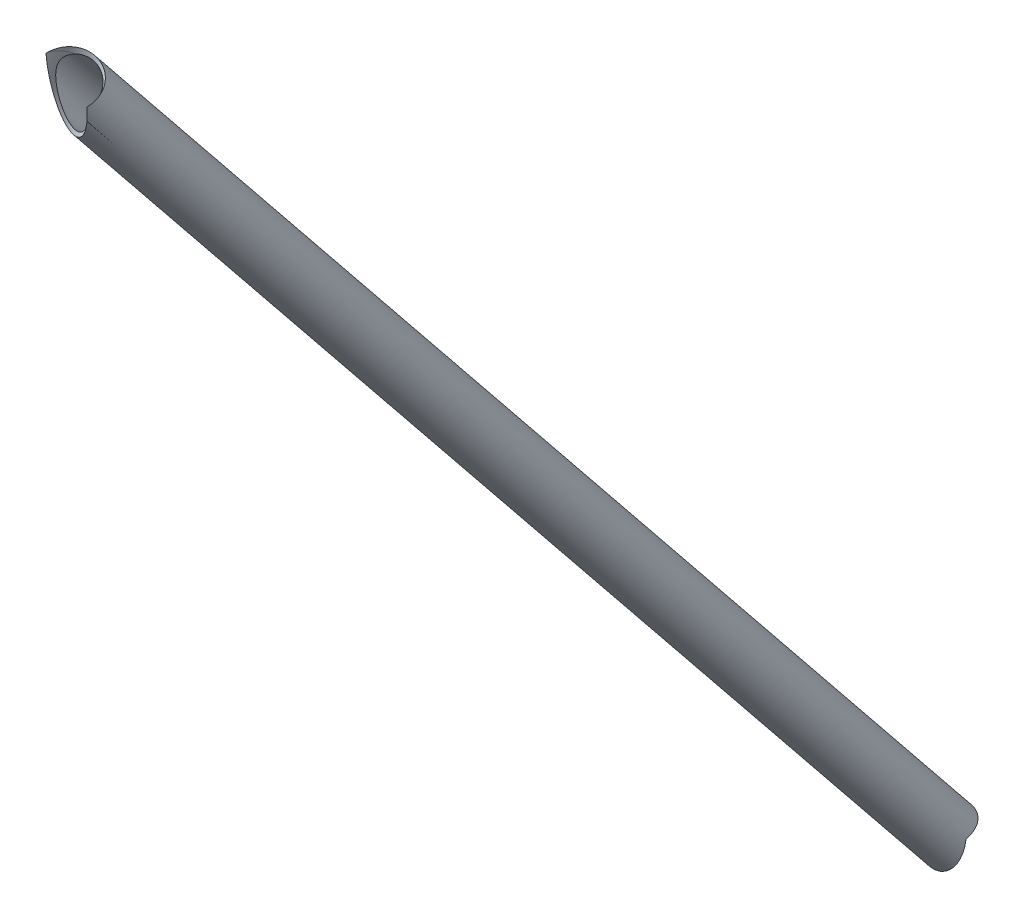
ISO-10303-21;
HEADER;
FILE_DESCRIPTION(('STEP AP214'),'2;1');
FILE_NAME('part.step','',(''),(''),'','','');
FILE_SCHEMA(('AUTOMOTIVE_DESIGN { 1 0 10303 214 1 1 1 1 }'));
ENDSEC;
DATA;
#1=APPLICATION_CONTEXT('core data for automotive mechanical design processes');
#2=APPLICATION_PROTOCOL_DEFINITION('international standard','automotive_design',2000,#1);
#3=PRODUCT_CONTEXT('',#1,'mechanical');
#4=PRODUCT('Part','Part','',(#3));
#5=PRODUCT_RELATED_PRODUCT_CATEGORY('part','',(#4));
#6=PRODUCT_DEFINITION_FORMATION('','',#4);
#7=PRODUCT_DEFINITION_CONTEXT('part definition',#1,'design');
#8=PRODUCT_DEFINITION('design','',#6,#7);
#9=PRODUCT_DEFINITION_SHAPE('','',#8);
#10=(LENGTH_UNIT() NAMED_UNIT(*) SI_UNIT(.MILLI.,.METRE.));
#11=(NAMED_UNIT(*) PLANE_ANGLE_UNIT() SI_UNIT($,.RADIAN.));
#12=(NAMED_UNIT(*) SI_UNIT($,.STERADIAN.) SOLID_ANGLE_UNIT());
#13=UNCERTAINTY_MEASURE_WITH_UNIT(LENGTH_MEASURE(1.E-05),#10,'distance_accuracy_value','');
#14=(GEOMETRIC_REPRESENTATION_CONTEXT(3) GLOBAL_UNCERTAINTY_ASSIGNED_CONTEXT((#13)) GLOBAL_UNIT_ASSIGNED_CONTEXT((#10,
#11,#12)) REPRESENTATION_CONTEXT('',''));
#15=CARTESIAN_POINT('',(0.,0.,0.));
#16=DIRECTION('',(0.,0.,1.));
#17=DIRECTION('',(1.,0.,0.));
#18=AXIS2_PLACEMENT_3D('',#15,#16,#17);
#19=CARTESIAN_POINT('',(-271.504604576402,378.994436719443,-750.538321143166));
#20=DIRECTION('',(0.,-1.,0.));
#21=DIRECTION('',(0.,0.,-1.));
#22=AXIS2_PLACEMENT_3D('',#19,#20,#21);
#23=PLANE('',#22);
#24=CARTESIAN_POINT('',(-264.151567479869,378.994436719443,-749.628370424457));
#25=DIRECTION('',(0.,-1.,0.));
#26=DIRECTION('',(-0.293467227757389,0.,-0.955969134560522));
#27=AXIS2_PLACEMENT_3D('',#24,#25,#26);
#28=ELLIPSE('',#27,17.0590011908449,12.7);
#29=CARTESIAN_POINT('',(-277.201757249883,378.994436719443,-750.538321143166));
#30=VERTEX_POINT('',#29);
#31=CARTESIAN_POINT('',(-251.338051674671,378.994436719443,-750.538321143167));
#32=VERTEX_POINT('',#31);
#33=EDGE_CURVE('E59',#30,#32,#28,.T.);
#34=ORIENTED_EDGE('',*,*,#33,.T.);
#35=DIRECTION('',(-1.,0.,0.));
#36=VECTOR('',#35,1.);
#37=CARTESIAN_POINT('',(-271.504604576402,378.994436719443,-750.538321143166));
#38=LINE('',#37,#36);
#39=CARTESIAN_POINT('',(-253.02455564414,378.994436719443,-750.538321143166));
#40=VERTEX_POINT('',#39);
#41=EDGE_CURVE('E52',#32,#40,#38,.T.);
#42=ORIENTED_EDGE('',*,*,#41,.T.);
#43=CARTESIAN_POINT('',(-264.151567479869,378.994436719443,-749.628370424457));
#44=DIRECTION('',(0.,-1.,0.));
#45=DIRECTION('',(-0.293467227757389,0.,-0.955969134560522));
#46=AXIS2_PLACEMENT_3D('',#43,#44,#45);
#47=ELLIPSE('',#46,14.8413310360351,11.049);
#48=CARTESIAN_POINT('',(-275.515253280414,378.994436719443,-750.538321143166));
#49=VERTEX_POINT('',#48);
#50=EDGE_CURVE('E11',#49,#40,#47,.T.);
#51=ORIENTED_EDGE('',*,*,#50,.F.);
#52=DIRECTION('',(1.,0.,0.));
#53=VECTOR('',#52,1.);
#54=CARTESIAN_POINT('',(-8.57647286522933E-12,378.994436719438,-750.538321143169));
#55=LINE('',#54,#53);
#56=EDGE_CURVE('E149',#30,#49,#55,.T.);
#57=ORIENTED_EDGE('',*,*,#56,.F.);
#58=EDGE_LOOP('',(#34,#42,#51,#57));
#59=FACE_BOUND('',#58,.T.);
#60=ADVANCED_FACE('F43',(#59),#23,.T.);
#61=CARTESIAN_POINT('',(-76.9133172811907,1090.43072922397,-139.699999999994));
#62=DIRECTION('',(-0.195933492226985,-0.744475005184678,-0.63825311066928));
#63=DIRECTION('',(0.,0.65086877876647,-0.759190248111134));
#64=AXIS2_PLACEMENT_3D('',#61,#62,#63);
#65=CYLINDRICAL_SURFACE('',#64,12.7);
#66=ORIENTED_EDGE('',*,*,#33,.F.);
#67=CARTESIAN_POINT('',(-264.430907790305,377.933046567629,-750.538321143166));
#68=DIRECTION('',(0.,0.,-1.));
#69=DIRECTION('',(-0.25451640245683,-0.967068457184099,0.));
#70=AXIS2_PLACEMENT_3D('',#67,#68,#69);
#71=ELLIPSE('',#70,19.898062050466,12.7);
#72=EDGE_CURVE('E104',#32,#30,#71,.T.);
#73=ORIENTED_EDGE('',*,*,#72,.F.);
#74=EDGE_LOOP('',(#66,#73));
#75=FACE_BOUND('',#74,.T.);
#76=CARTESIAN_POINT('',(-65.1909581317442,1085.86136610262,-137.968752866685));
#77=CARTESIAN_POINT('',(-65.188666444551,1085.86385101342,-137.977711390029));
#78=CARTESIAN_POINT('',(-65.1863834730635,1085.86633931412,-137.986671322024));
#79=CARTESIAN_POINT('',(-65.088683670973,1085.97337990387,-138.371641602569));
#80=CARTESIAN_POINT('',(-65.0086105863419,1086.08388833096,-138.750093723568));
#81=CARTESIAN_POINT('',(-64.8797852868702,1086.31618247505,-139.509060862578));
#82=CARTESIAN_POINT('',(-64.8310554192449,1086.43797616764,-139.889577157817));
#83=CARTESIAN_POINT('',(-64.7653393119385,1086.69249001266,-140.650826634424));
#84=CARTESIAN_POINT('',(-64.7484349576303,1086.82523743599,-141.031557860874));
#85=CARTESIAN_POINT('',(-64.7469726942681,1087.10066587205,-141.789469760058));
#86=CARTESIAN_POINT('',(-64.7624143768743,1087.24334675935,-142.166650477554));
#87=CARTESIAN_POINT('',(-64.8258905745654,1087.53796741109,-142.914936988181));
#88=CARTESIAN_POINT('',(-64.8739490080601,1087.68991389569,-143.286038118378));
#89=CARTESIAN_POINT('',(-65.0027698948558,1088.00209421645,-144.019004471865));
#90=CARTESIAN_POINT('',(-65.0835341236163,1088.16232850212,-144.380869192615));
#91=CARTESIAN_POINT('',(-65.2775916909309,1088.48994420323,-145.09208200145));
#92=CARTESIAN_POINT('',(-65.3908588313733,1088.6573197705,-145.441439916252));
#93=CARTESIAN_POINT('',(-65.6496298878435,1088.99820180688,-146.124896148193));
#94=CARTESIAN_POINT('',(-65.795131958064,1089.17170792446,-146.458995337743));
#95=CARTESIAN_POINT('',(-66.111293232389,1089.51649359103,-147.0957800965));
#96=CARTESIAN_POINT('',(-66.2807045592629,1089.68758180233,-147.399188750857));
#97=CARTESIAN_POINT('',(-66.6479015992095,1090.03297497532,-147.986396271351));
#98=CARTESIAN_POINT('',(-66.8456869148006,1090.20727989193,-148.270195412109));
#99=CARTESIAN_POINT('',(-67.2684920621044,1090.55767321172,-148.815420573037));
#100=CARTESIAN_POINT('',(-67.4935054570135,1090.7337611844,-149.076851856188));
#101=CARTESIAN_POINT('',(-67.9693759754678,1091.08624486991,-149.574801752012));
#102=CARTESIAN_POINT('',(-68.2202313283084,1091.26264056083,-149.811322069353));
#103=CARTESIAN_POINT('',(-68.7272743641682,1091.60160709105,-150.241135323141));
#104=CARTESIAN_POINT('',(-68.9818112328058,1091.76426818196,-150.436306897066));
#105=CARTESIAN_POINT('',(-69.5099388076268,1092.08711442484,-150.801270781749));
#106=CARTESIAN_POINT('',(-69.7835285952333,1092.24729969571,-150.97106431479));
#107=CARTESIAN_POINT('',(-70.347717881244,1092.56376472084,-151.283655111482));
#108=CARTESIAN_POINT('',(-70.6383120015847,1092.72004568787,-151.426460850933));
#109=CARTESIAN_POINT('',(-71.2343945661614,1093.02737005288,-151.683831225567));
#110=CARTESIAN_POINT('',(-71.5398825214996,1093.17841362252,-151.798396787001));
#111=CARTESIAN_POINT('',(-72.1465913934112,1093.46596423118,-151.992904967753));
#112=CARTESIAN_POINT('',(-72.447159664937,1093.6028162686,-152.074377133767));
#113=CARTESIAN_POINT('',(-73.0573222169225,1093.86951944027,-152.210542332079));
#114=CARTESIAN_POINT('',(-73.3669161145886,1093.99937087075,-152.265236498336));
#115=CARTESIAN_POINT('',(-73.9928563176063,1094.2510348799,-152.3475199754));
#116=CARTESIAN_POINT('',(-74.3092019187034,1094.37284829163,-152.375112099177));
#117=CARTESIAN_POINT('',(-74.9463865504262,1094.60751398978,-152.403146084475));
#118=CARTESIAN_POINT('',(-75.2672256022173,1094.72036623398,-152.403587818066));
#119=CARTESIAN_POINT('',(-75.9071365878519,1094.93494719361,-152.377683821308));
#120=CARTESIAN_POINT('',(-76.2261818817213,1095.03679543086,-152.351666791087));
#121=CARTESIAN_POINT('',(-76.8642124956351,1095.23023703194,-152.273770239989));
#122=CARTESIAN_POINT('',(-77.1831978164891,1095.32183054586,-152.221891097701));
#123=CARTESIAN_POINT('',(-77.8190001936864,1095.49418712093,-152.092900329441));
#124=CARTESIAN_POINT('',(-78.1358171072244,1095.57494947515,-152.015787057635));
#125=CARTESIAN_POINT('',(-78.7652160423884,1095.7251699672,-151.837145602303));
#126=CARTESIAN_POINT('',(-79.0777979650451,1095.79462784125,-151.735616849237));
#127=CARTESIAN_POINT('',(-79.7052044762304,1095.92361443728,-151.506031754003));
#128=CARTESIAN_POINT('',(-80.0198584672111,1095.98282138535,-151.377328496576));
#129=CARTESIAN_POINT('',(-80.6406481847395,1096.08865982017,-151.096383033118));
#130=CARTESIAN_POINT('',(-80.9467838000795,1096.1352911428,-150.944140519951));
#131=CARTESIAN_POINT('',(-81.548697924569,1096.21582225412,-150.617423166169));
#132=CARTESIAN_POINT('',(-81.8444759919462,1096.24972150035,-150.442947378724));
#133=CARTESIAN_POINT('',(-82.4239631872306,1096.30473160813,-150.073164634555));
#134=CARTESIAN_POINT('',(-82.7076715399862,1096.32584164946,-149.877856342724));
#135=CARTESIAN_POINT('',(-83.2753346139065,1096.35604567648,-149.457591243448));
#136=CARTESIAN_POINT('',(-83.5585872333799,1096.36448350186,-149.231638438464));
#137=CARTESIAN_POINT('',(-84.1083683429922,1096.36742959885,-148.760147357799));
#138=CARTESIAN_POINT('',(-84.3748962145181,1096.36193735554,-148.514608358428));
#139=CARTESIAN_POINT('',(-84.8898236446164,1096.33724568671,-148.005647674693));
#140=CARTESIAN_POINT('',(-85.1382155461314,1096.31804050801,-147.742218526621));
#141=CARTESIAN_POINT('',(-85.6154852108881,1096.26621262696,-147.199294426504));
#142=CARTESIAN_POINT('',(-85.8443544890412,1096.23358412595,-146.91979257627));
#143=CARTESIAN_POINT('',(-86.2931206584667,1096.15315365518,-146.331088713538));
#144=CARTESIAN_POINT('',(-86.5118534163009,1096.10462324449,-146.021098132569));
#145=CARTESIAN_POINT('',(-86.924766828057,1095.99359621255,-145.387746894548));
#146=CARTESIAN_POINT('',(-87.1189568873272,1095.93110496697,-145.064391422669));
#147=CARTESIAN_POINT('',(-87.4815168877819,1095.79281848985,-144.406831598147));
#148=CARTESIAN_POINT('',(-87.6499198163796,1095.71704052581,-144.072641779861));
#149=CARTESIAN_POINT('',(-87.9601531767715,1095.55279060464,-143.395338043799));
#150=CARTESIAN_POINT('',(-88.1019966150131,1095.46432489849,-143.052228588305));
#151=CARTESIAN_POINT('',(-88.306219356281,1095.31380154785,-142.50011020026));
#152=CARTESIAN_POINT('',(-88.3774665557819,1095.25562189672,-142.293268393167));
#153=CARTESIAN_POINT('',(-88.5101382981054,1095.1352170638,-141.877754450638));
#154=CARTESIAN_POINT('',(-88.571569536568,1095.07299468072,-141.669083666152));
#155=CARTESIAN_POINT('',(-88.6305906750602,1095.00591891141,-141.450223725784));
#156=CARTESIAN_POINT('',(-88.6331386561691,1095.00300762139,-141.440736137982));
#157=CARTESIAN_POINT('',(-88.6356764306371,1095.00009234533,-141.431247133303));
#158=B_SPLINE_CURVE_WITH_KNOTS('',3,(#76,#77,#78,#79,#80,#81,#82,#83,#84,#85,#86,#87,#88,#89,
#90,#91,#92,#93,#94,#95,#96,#97,#98,#99,#100,#101,#102,#103,#104,#105,#106,#107,#108,#109,#110,
#111,#112,#113,#114,#115,#116,#117,#118,#119,#120,#121,#122,#123,#124,#125,#126,#127,#128,#129,
#130,#131,#132,#133,#134,#135,#136,#137,#138,#139,#140,#141,#142,#143,#144,#145,#146,#147,#148,
#149,#150,#151,#152,#153,#154,#155,#156,#157),.UNSPECIFIED.,.F.,.F.,(4,2,2,2,2,2,2,2,2,2,2,2,2,
2,2,2,2,2,2,2,2,2,2,2,2,2,2,2,2,2,2,2,2,2,2,2,2,2,2,2,4),(0.,0.028725503737582,1.23402195135505,
2.4401768063648,3.64943081558698,4.85866955915695,6.06879601725525,7.27898817681424,
8.48820761978224,9.69735783941325,10.8578535324615,12.0183329701093,13.1785386007745,
14.3386647863434,15.4162053524941,16.49369400431,17.5708436951052,18.6479580516913,
19.6671992077214,20.6863971985654,21.7054893938356,22.7245863909212,23.731175853744,
24.7377505817912,25.7443909742602,26.7510548509035,27.7851229858924,28.8192046143737,
29.8533302951508,30.8875222904972,31.9736128845041,33.0597436270568,34.1463303166941,
35.2333868868123,36.3795385355036,37.5252496110108,38.6694826010161,39.8131537747779,
40.4920583846122,41.1704979063167,41.201236115237),.UNSPECIFIED.);
#159=CARTESIAN_POINT('',(-65.1909581317445,1085.86136610262,-137.968752866684));
#160=VERTEX_POINT('',#159);
#161=CARTESIAN_POINT('',(-88.6356764306371,1095.00009234533,-141.431247133303));
#162=VERTEX_POINT('',#161);
#163=EDGE_CURVE('E93',#160,#162,#158,.T.);
#164=ORIENTED_EDGE('',*,*,#163,.F.);
#165=CARTESIAN_POINT('',(-76.9133172811906,1090.43072922397,-139.699999999994));
#166=DIRECTION('',(0.243854446276013,0.27300598632505,-0.930592682360069));
#167=DIRECTION('',(-0.297604334848637,-0.892197949254437,-0.339727065782927));
#168=AXIS2_PLACEMENT_3D('',#165,#166,#167);
#169=ELLIPSE('',#168,37.0339818746205,12.7);
#170=EDGE_CURVE('E78',#162,#160,#169,.F.);
#171=ORIENTED_EDGE('',*,*,#170,.F.);
#172=EDGE_LOOP('',(#164,#171));
#173=FACE_BOUND('',#172,.T.);
#174=ADVANCED_FACE('F99',(#75,#173),#65,.T.);
#175=CARTESIAN_POINT('',(-76.9133172811907,1090.43072922397,-139.699999999994));
#176=DIRECTION('',(-0.195933492226985,-0.744475005184678,-0.63825311066928));
#177=DIRECTION('',(0.,0.65086877876647,-0.759190248111134));
#178=AXIS2_PLACEMENT_3D('',#175,#176,#177);
#179=CYLINDRICAL_SURFACE('',#178,11.049);
#180=ORIENTED_EDGE('',*,*,#50,.T.);
#181=CARTESIAN_POINT('',(-264.430907790305,377.933046567629,-750.538321143166));
#182=DIRECTION('',(0.,0.,-1.));
#183=DIRECTION('',(-0.25451640245683,-0.967068457184099,0.));
#184=AXIS2_PLACEMENT_3D('',#181,#182,#183);
#185=ELLIPSE('',#184,17.3113139839054,11.049);
#186=EDGE_CURVE('E154',#40,#49,#185,.T.);
#187=ORIENTED_EDGE('',*,*,#186,.T.);
#188=EDGE_LOOP('',(#180,#187));
#189=FACE_BOUND('',#188,.T.);
#190=CARTESIAN_POINT('',(-83.2243835741743,1092.89077614865,-150.442840005036));
#191=CARTESIAN_POINT('',(-83.4184772719162,1092.85174659829,-150.337804492597));
#192=CARTESIAN_POINT('',(-83.6099806299551,1092.80631517863,-150.230237717723));
#193=CARTESIAN_POINT('',(-83.9874306119363,1092.70148759901,-150.011765062892));
#194=CARTESIAN_POINT('',(-84.1733715071692,1092.64207756536,-149.900855961671));
#195=CARTESIAN_POINT('',(-84.5407210674086,1092.50754970154,-149.676545923619));
#196=CARTESIAN_POINT('',(-84.7220675266626,1092.43228376144,-149.563131221157));
#197=CARTESIAN_POINT('',(-85.0776037429577,1092.26526342298,-149.337277738421));
#198=CARTESIAN_POINT('',(-85.2517953478945,1092.17351331534,-149.22483871215));
#199=CARTESIAN_POINT('',(-85.593814925449,1091.97165273629,-149.002682165981));
#200=CARTESIAN_POINT('',(-85.7615737900452,1091.86138847668,-148.892997112567));
#201=CARTESIAN_POINT('',(-86.0882363516932,1091.62253278683,-148.680521324228));
#202=CARTESIAN_POINT('',(-86.2471402694042,1091.49394181356,-148.577730417495));
#203=CARTESIAN_POINT('',(-86.5542988841754,1091.21952185453,-148.382795911761));
#204=CARTESIAN_POINT('',(-86.7026122411462,1091.07380196977,-148.290591606789));
#205=CARTESIAN_POINT('',(-86.988936185135,1090.76576308094,-148.118810329708));
#206=CARTESIAN_POINT('',(-87.1269481959467,1090.60344637817,-148.039231610844));
#207=CARTESIAN_POINT('',(-87.3750432240553,1090.2865006762,-147.903896570814));
#208=CARTESIAN_POINT('',(-87.4864225620759,1090.13362427485,-147.846387421679));
#209=CARTESIAN_POINT('',(-87.7012163683581,1089.81875193764,-147.742692505997));
#210=CARTESIAN_POINT('',(-87.8046313702445,1089.65675661404,-147.69650598036));
#211=CARTESIAN_POINT('',(-88.0040812640173,1089.32505092909,-147.615180441026));
#212=CARTESIAN_POINT('',(-88.1000963340357,1089.15532166062,-147.580070369694));
#213=CARTESIAN_POINT('',(-88.2849706819208,1088.81023209066,-147.520397792407));
#214=CARTESIAN_POINT('',(-88.3738290419486,1088.63487107093,-147.495836637595));
#215=CARTESIAN_POINT('',(-88.6116260155291,1088.14188324206,-147.440954548097));
#216=CARTESIAN_POINT('',(-88.7535350309371,1087.81969597542,-147.421013785676));
#217=CARTESIAN_POINT('',(-89.0203557165875,1087.16778258966,-147.405509091619));
#218=CARTESIAN_POINT('',(-89.1452515519007,1086.83804977641,-147.409967712832));
#219=CARTESIAN_POINT('',(-89.38151107087,1086.17314907407,-147.437835283987));
#220=CARTESIAN_POINT('',(-89.4928178355519,1085.83796456899,-147.46132099436));
#221=CARTESIAN_POINT('',(-89.6509032565722,1085.3335856982,-147.507510731745));
#222=CARTESIAN_POINT('',(-89.7021116059215,1085.16522012895,-147.524730451034));
#223=CARTESIAN_POINT('',(-89.8018091777574,1084.82803994466,-147.562384313199));
#224=CARTESIAN_POINT('',(-89.8502983916485,1084.65922532819,-147.582818466236));
#225=CARTESIAN_POINT('',(-89.9772574706109,1084.20498192158,-147.641522482895));
#226=CARTESIAN_POINT('',(-90.0533994961743,1083.91923767653,-147.682390246274));
#227=CARTESIAN_POINT('',(-90.1992618482934,1083.34708594854,-147.770545478983));
#228=CARTESIAN_POINT('',(-90.2689813935354,1083.06067838925,-147.817833727657));
#229=CARTESIAN_POINT('',(-90.402562503245,1082.48727640627,-147.917600622196));
#230=CARTESIAN_POINT('',(-90.4664215638979,1082.2002817848,-147.970081466811));
#231=CARTESIAN_POINT('',(-90.5886351176869,1081.62591123916,-148.079227669436));
#232=CARTESIAN_POINT('',(-90.6469893310768,1081.33853529635,-148.135893239845));
#233=CARTESIAN_POINT('',(-90.8144592545411,1080.47468619169,-148.311171751969));
#234=CARTESIAN_POINT('',(-90.9157032510036,1079.89770086698,-148.43484891005));
#235=CARTESIAN_POINT('',(-91.0982772664845,1078.74268463004,-148.690795823182));
#236=CARTESIAN_POINT('',(-91.1796119664707,1078.16465399584,-148.823063549191));
#237=CARTESIAN_POINT('',(-91.3226633798795,1077.0048365408,-149.093457509147));
#238=CARTESIAN_POINT('',(-91.3842930222302,1076.42304433054,-149.231606769635));
#239=CARTESIAN_POINT('',(-91.4865345215782,1075.25818126006,-149.510618688993));
#240=CARTESIAN_POINT('',(-91.5271439832751,1074.67511026172,-149.6514816552));
#241=CARTESIAN_POINT('',(-91.5854845892419,1073.50902898089,-149.93344796292));
#242=CARTESIAN_POINT('',(-91.6032586713392,1072.92602065163,-150.074550352282));
#243=CARTESIAN_POINT('',(-91.6133081277858,1071.75944688034,-150.35519957643));
#244=CARTESIAN_POINT('',(-91.6055886225159,1071.1758815737,-150.494746717937));
#245=CARTESIAN_POINT('',(-91.5715929523656,1070.29562182892,-150.702463788476));
#246=CARTESIAN_POINT('',(-91.5562940310716,1069.99881394673,-150.772025456989));
#247=CARTESIAN_POINT('',(-91.5172858361929,1069.40545488454,-150.909843728004));
#248=CARTESIAN_POINT('',(-91.4935770996979,1069.10890368935,-150.978100413554));
#249=CARTESIAN_POINT('',(-91.4368414415205,1068.51592124014,-151.113019989496));
#250=CARTESIAN_POINT('',(-91.4038027198882,1068.21949061714,-151.179680744896));
#251=CARTESIAN_POINT('',(-91.3273374113153,1067.62749185443,-151.310868367712));
#252=CARTESIAN_POINT('',(-91.28391115239,1067.33192368779,-151.375395302435));
#253=CARTESIAN_POINT('',(-91.1857463591609,1066.74463388697,-151.501239085684));
#254=CARTESIAN_POINT('',(-91.1311060817814,1066.45290081303,-151.562578375852));
#255=CARTESIAN_POINT('',(-91.0086541332534,1065.87144119359,-151.681967199314));
#256=CARTESIAN_POINT('',(-90.9408400885127,1065.58171501946,-151.740016137327));
#257=CARTESIAN_POINT('',(-90.790157717602,1065.00599582438,-151.851832691411));
#258=CARTESIAN_POINT('',(-90.7073210861082,1064.71999627738,-151.905608984767));
#259=CARTESIAN_POINT('',(-90.5239718985032,1064.15282338611,-152.007864176378));
#260=CARTESIAN_POINT('',(-90.4234691591164,1063.8716474562,-152.056345992543));
#261=CARTESIAN_POINT('',(-90.2378122038466,1063.40725078979,-152.131760520948));
#262=CARTESIAN_POINT('',(-90.1583762097897,1063.22204841964,-152.160557586137));
#263=CARTESIAN_POINT('',(-89.988813609078,1062.85597271211,-152.214458634047));
#264=CARTESIAN_POINT('',(-89.8986853279634,1062.67510005814,-152.239562036942));
#265=CARTESIAN_POINT('',(-89.7065578476455,1062.3194333273,-152.285292891604));
#266=CARTESIAN_POINT('',(-89.6045743614443,1062.14463159445,-152.305926166495));
#267=CARTESIAN_POINT('',(-89.3873081960785,1061.80298388701,-152.341834637552));
#268=CARTESIAN_POINT('',(-89.2720315275908,1061.63613436458,-152.357112242824));
#269=CARTESIAN_POINT('',(-88.9845125490831,1061.25724343738,-152.385414200105));
#270=CARTESIAN_POINT('',(-88.8063214512146,1061.04941904594,-152.395852111068));
#271=CARTESIAN_POINT('',(-88.4211364810616,1060.66171797847,-152.402124564279));
#272=CARTESIAN_POINT('',(-88.2141728533669,1060.48181237015,-152.397974331208));
#273=CARTESIAN_POINT('',(-87.8820775924425,1060.24003879318,-152.378842603219));
#274=CARTESIAN_POINT('',(-87.7669530731804,1060.16372745688,-152.370215485496));
#275=CARTESIAN_POINT('',(-87.5304008321178,1060.02226533981,-152.348404323773));
#276=CARTESIAN_POINT('',(-87.4089733077218,1059.9571142098,-152.335220422412));
#277=CARTESIAN_POINT('',(-87.1609492514217,1059.83910756353,-152.304275050376));
#278=CARTESIAN_POINT('',(-87.0343568736853,1059.78624238608,-152.286517199807));
#279=CARTESIAN_POINT('',(-86.7772613201595,1059.69336988796,-152.246590002115));
#280=CARTESIAN_POINT('',(-86.6467585294835,1059.65336130564,-152.224421088207));
#281=CARTESIAN_POINT('',(-86.2926820423277,1059.5634008675,-152.159319992553));
#282=CARTESIAN_POINT('',(-86.0666620618117,1059.52544862425,-152.112575269621));
#283=CARTESIAN_POINT('',(-85.6138422122698,1059.48443588172,-152.009618313012));
#284=CARTESIAN_POINT('',(-85.387041893081,1059.481400974,-151.953399165968));
#285=CARTESIAN_POINT('',(-84.8228926405451,1059.51169862231,-151.803553078577));
#286=CARTESIAN_POINT('',(-84.4877663107581,1059.5642403359,-151.705406861421));
#287=CARTESIAN_POINT('',(-83.9971177448944,1059.68153709777,-151.551166655162));
#288=CARTESIAN_POINT('',(-83.8353061561656,1059.72716226976,-151.498486054864));
#289=CARTESIAN_POINT('',(-83.5158163075952,1059.82946881549,-151.391302103305));
#290=CARTESIAN_POINT('',(-83.3581373746908,1059.88614837602,-151.336799052187));
#291=CARTESIAN_POINT('',(-82.9199949236641,1060.05907680583,-151.181387092661));
#292=CARTESIAN_POINT('',(-82.6443788360028,1060.18618200871,-151.078917425813));
#293=CARTESIAN_POINT('',(-82.1063486530303,1060.46410273598,-150.871382575534));
#294=CARTESIAN_POINT('',(-81.8439464768572,1060.61493917791,-150.766315171888));
#295=CARTESIAN_POINT('',(-81.3307545270556,1060.9354043096,-150.554570852418));
#296=CARTESIAN_POINT('',(-81.0799917382115,1061.10507384997,-150.447890889167));
#297=CARTESIAN_POINT('',(-80.5895640821098,1061.45910091895,-150.233955675213));
#298=CARTESIAN_POINT('',(-80.3498954045247,1061.64345334457,-150.126700636358));
#299=CARTESIAN_POINT('',(-79.7795845617408,1062.10589371393,-149.86600898192));
#300=CARTESIAN_POINT('',(-79.4540578700355,1062.39024654518,-149.712513483717));
#301=CARTESIAN_POINT('',(-78.8201579522756,1062.97796568325,-149.406271713976));
#302=CARTESIAN_POINT('',(-78.5117925926435,1063.28134057611,-149.253525814818));
#303=CARTESIAN_POINT('',(-77.9095604234941,1063.90384503627,-148.949259607798));
#304=CARTESIAN_POINT('',(-77.6157201941814,1064.22300149341,-148.797741942298));
#305=CARTESIAN_POINT('',(-77.0413678171542,1064.87388377949,-148.496793676299));
#306=CARTESIAN_POINT('',(-76.7608535551233,1065.20560759936,-148.347362747389));
#307=CARTESIAN_POINT('',(-76.2102679570455,1065.88149547454,-148.050329853453));
#308=CARTESIAN_POINT('',(-75.9402564700844,1066.22571386483,-147.902740925121));
#309=CARTESIAN_POINT('',(-75.4109844763685,1066.92362184578,-147.610703263629));
#310=CARTESIAN_POINT('',(-75.1517243944857,1067.27731180984,-147.466254654674));
#311=CARTESIAN_POINT('',(-74.6432750253512,1067.99275079585,-147.181273609025));
#312=CARTESIAN_POINT('',(-74.3940751349848,1068.35449067452,-147.040737100339));
#313=CARTESIAN_POINT('',(-73.9046659383062,1069.08566804651,-146.76415797228));
#314=CARTESIAN_POINT('',(-73.6644563810601,1069.45510532453,-146.628115227493));
#315=CARTESIAN_POINT('',(-73.2340115461721,1070.13540480341,-146.38496871182));
#316=CARTESIAN_POINT('',(-73.0424336230786,1070.44510754382,-146.276992370499));
#317=CARTESIAN_POINT('',(-72.6646527214921,1071.06923754716,-146.065382011971));
#318=CARTESIAN_POINT('',(-72.4784496918209,1071.38366476505,-145.961747953413));
#319=CARTESIAN_POINT('',(-72.1110458596275,1072.0174076733,-145.759574586322));
#320=CARTESIAN_POINT('',(-71.9298491265548,1072.33672703055,-145.66103936879));
#321=CARTESIAN_POINT('',(-71.572460069918,1072.98000093642,-145.470229148181));
#322=CARTESIAN_POINT('',(-71.3962676356065,1073.30395538223,-145.377954006504));
#323=CARTESIAN_POINT('',(-71.049769510874,1073.95480360271,-145.201552477562));
#324=CARTESIAN_POINT('',(-70.8794369502726,1074.28167170185,-145.117384382953));
#325=CARTESIAN_POINT('',(-70.5437068988502,1074.94027032809,-144.958462746559));
#326=CARTESIAN_POINT('',(-70.3783099901509,1075.27200142191,-144.883710311954));
#327=CARTESIAN_POINT('',(-70.0529507698205,1075.94009155815,-144.746204743074));
#328=CARTESIAN_POINT('',(-69.8929821131553,1076.27644450284,-144.683437172493));
#329=CARTESIAN_POINT('',(-69.5789226751763,1076.95430982709,-144.573177873335));
#330=CARTESIAN_POINT('',(-69.4248299647766,1077.29582046107,-144.525681092599));
#331=CARTESIAN_POINT('',(-69.1713255627061,1077.87533904299,-144.462487339926));
#332=CARTESIAN_POINT('',(-69.070027202869,1078.11193761388,-144.441484240342));
#333=CARTESIAN_POINT('',(-68.8713906606884,1078.58758626701,-144.410743105251));
#334=CARTESIAN_POINT('',(-68.7740528582366,1078.82663658168,-144.40100614793));
#335=CARTESIAN_POINT('',(-68.5843270739191,1079.30690511905,-144.395116914912));
#336=CARTESIAN_POINT('',(-68.4919390462529,1079.54812332168,-144.398964513493));
#337=CARTESIAN_POINT('',(-68.3135448866795,1080.03214356714,-144.422941527662));
#338=CARTESIAN_POINT('',(-68.2275374622969,1080.27494527831,-144.443067635939));
#339=CARTESIAN_POINT('',(-68.0790924599372,1080.71594324216,-144.496952710451));
#340=CARTESIAN_POINT('',(-68.0152434132353,1080.9140523962,-144.527487202838));
#341=CARTESIAN_POINT('',(-67.8944844568577,1081.30973299445,-144.602700884755));
#342=CARTESIAN_POINT('',(-67.8375738546091,1081.50730449039,-144.647378660945));
#343=CARTESIAN_POINT('',(-67.7324610473613,1081.90009213841,-144.751797501758));
#344=CARTESIAN_POINT('',(-67.6842312210188,1082.09531384823,-144.811489285761));
#345=CARTESIAN_POINT('',(-67.597939379289,1082.48262765237,-144.946427619163));
#346=CARTESIAN_POINT('',(-67.5598767761823,1082.67471992698,-145.021673269019));
#347=CARTESIAN_POINT('',(-67.4953198436893,1083.05529383109,-145.187684932773));
#348=CARTESIAN_POINT('',(-67.4688854856645,1083.24375205783,-145.278528122604));
#349=CARTESIAN_POINT('',(-67.4291194452226,1083.61477484516,-145.474063791729));
#350=CARTESIAN_POINT('',(-67.4157884057888,1083.79733911612,-145.578756950358));
#351=CARTESIAN_POINT('',(-67.4029645269192,1084.15671035199,-145.800458725895));
#352=CARTESIAN_POINT('',(-67.4035489456833,1084.33347971506,-145.917532505117));
#353=CARTESIAN_POINT('',(-67.4190284248832,1084.67983417409,-146.160936613952));
#354=CARTESIAN_POINT('',(-67.4339240568816,1084.84941898283,-146.287267313083));
#355=CARTESIAN_POINT('',(-67.4800760774569,1085.19776830866,-146.559277599691));
#356=CARTESIAN_POINT('',(-67.5127927746133,1085.37580372303,-146.705640093327));
#357=CARTESIAN_POINT('',(-67.594866463687,1085.72387462346,-147.003202868123));
#358=CARTESIAN_POINT('',(-67.6442305827481,1085.8939066475,-147.154405196191));
#359=CARTESIAN_POINT('',(-67.7584114286519,1086.22514978008,-147.457483000234));
#360=CARTESIAN_POINT('',(-67.8230883515632,1086.38642534477,-147.609340843762));
#361=CARTESIAN_POINT('',(-67.9312523901694,1086.62330859726,-147.836774142872));
#362=CARTESIAN_POINT('',(-67.9691427990743,1086.70139240962,-147.912487427895));
#363=CARTESIAN_POINT('',(-68.0485547929362,1086.8559993178,-148.063586723532));
#364=CARTESIAN_POINT('',(-68.0900760328972,1086.93252256106,-148.138972764528));
#365=CARTESIAN_POINT('',(-68.133371426457,1087.00831567354,-148.214084582482));
#366=B_SPLINE_CURVE_WITH_KNOTS('',3,(#190,#191,#192,#193,#194,#195,#196,#197,#198,#199,#200,
#201,#202,#203,#204,#205,#206,#207,#208,#209,#210,#211,#212,#213,#214,#215,#216,#217,#218,#219,
#220,#221,#222,#223,#224,#225,#226,#227,#228,#229,#230,#231,#232,#233,#234,#235,#236,#237,#238,
#239,#240,#241,#242,#243,#244,#245,#246,#247,#248,#249,#250,#251,#252,#253,#254,#255,#256,#257,
#258,#259,#260,#261,#262,#263,#264,#265,#266,#267,#268,#269,#270,#271,#272,#273,#274,#275,#276,
#277,#278,#279,#280,#281,#282,#283,#284,#285,#286,#287,#288,#289,#290,#291,#292,#293,#294,#295,
#296,#297,#298,#299,#300,#301,#302,#303,#304,#305,#306,#307,#308,#309,#310,#311,#312,#313,#314,
#315,#316,#317,#318,#319,#320,#321,#322,#323,#324,#325,#326,#327,#328,#329,#330,#331,#332,#333,
#334,#335,#336,#337,#338,#339,#340,#341,#342,#343,#344,#345,#346,#347,#348,#349,#350,#351,#352,
#353,#354,#355,#356,#357,#358,#359,#360,#361,#362,#363,#364,#365),.UNSPECIFIED.,.F.,.F.,(4,2,2,
2,2,2,2,2,2,2,2,2,2,2,2,2,2,2,2,2,2,2,2,2,2,2,2,2,2,2,2,2,2,2,2,2,2,2,2,2,2,2,2,2,2,2,2,2,2,2,2,
2,2,2,2,2,2,2,2,2,2,2,2,2,2,2,2,2,2,2,2,2,2,2,2,2,2,2,2,2,2,2,2,2,2,2,2,4),(0.,
0.672317239539225,1.34530458570351,2.0248816209325,2.70428202268346,3.38963365133081,
4.07496819384602,4.75615266040638,5.43724280250033,6.02961685443153,6.6219511816413,
7.2158206772837,7.8097662150606,8.86570634126453,9.92262265926867,10.9838242231469,
11.5142510746346,12.0446796027983,12.9400783126931,13.8355858070193,14.7314741310902,
15.6274079580468,17.4230518902732,19.218273233864,21.0213209044145,22.8245739914047,
24.6244313985635,26.423927326785,27.339533578088,28.2550813650548,29.1717923026308,
30.0884742963296,30.997443247036,31.9065761239803,32.8138127655492,33.7205468573333,
34.3309493755758,34.9414476120749,35.5511457212138,36.160569220868,36.9797981742,
37.7981724063448,38.2127670925895,38.6273488019328,39.0416033885556,39.4558173109093,
40.1541158030433,40.8529260585859,41.9058689430007,42.4341676911175,42.9623798566536,
43.9218022502475,44.8820750996293,45.8444731423903,46.806538154294,48.1816161368036,
49.5573193230122,50.9354532409124,52.3133677668786,53.6982364531316,55.0831598143117,
56.466583226664,57.8499679967241,58.9893942851535,60.1288097207613,61.2691256131599,
62.4094162502009,63.5434863271163,64.6776896343521,65.8105180030038,66.942971202215,
67.7174246809131,68.4919522699119,69.2664726909155,70.0408357917653,70.6714431936971,
71.3019875988281,71.9304887708541,72.558953604319,73.1906227231286,73.8223228365617,
74.4575309434036,75.0927644202988,75.7902513490399,76.4880372678449,77.1796827464268,
77.5251498178745,77.8705840991807),.UNSPECIFIED.);
#367=CARTESIAN_POINT('',(-83.224383574175,1092.89077614865,-150.442840005036));
#368=VERTEX_POINT('',#367);
#369=CARTESIAN_POINT('',(-68.133371426457,1087.00831567354,-148.214084582482));
#370=VERTEX_POINT('',#369);
#371=EDGE_CURVE('E89',#368,#370,#366,.T.);
#372=ORIENTED_EDGE('',*,*,#371,.T.);
#373=CARTESIAN_POINT('',(-67.6290488963545,1085.81810934336,-147.102408226526));
#374=CARTESIAN_POINT('',(-67.6602509201102,1085.92767026421,-147.196800090187));
#375=CARTESIAN_POINT('',(-67.6948497697081,1086.03537249511,-147.292182863298));
#376=CARTESIAN_POINT('',(-67.7705949670946,1086.247316187,-147.484118383574));
#377=CARTESIAN_POINT('',(-67.8117391952846,1086.35155875516,-147.580670742673));
#378=CARTESIAN_POINT('',(-67.9002919940358,1086.55677697872,-147.774070089));
#379=CARTESIAN_POINT('',(-67.947692369244,1086.65775669654,-147.870916531566));
#380=CARTESIAN_POINT('',(-68.0485685784097,1086.85685529466,-148.064385459612));
#381=CARTESIAN_POINT('',(-68.1020449371184,1086.95497392694,-148.161007925012));
#382=CARTESIAN_POINT('',(-68.270936858758,1087.24484855135,-148.449114449018));
#383=CARTESIAN_POINT('',(-68.3950876658845,1087.43274503629,-148.639433753606));
#384=CARTESIAN_POINT('',(-68.6650715314649,1087.79965387855,-149.013177186986));
#385=CARTESIAN_POINT('',(-68.8109119881691,1087.9786631766,-149.196598936198));
#386=CARTESIAN_POINT('',(-69.1220771724799,1088.32797002452,-149.552834046577));
#387=CARTESIAN_POINT('',(-69.2873136586739,1088.49830233291,-149.725690398056));
#388=CARTESIAN_POINT('',(-69.6363321002893,1088.83159465515,-150.059293854163));
#389=CARTESIAN_POINT('',(-69.8201118705775,1088.99455553437,-150.220042381682));
#390=CARTESIAN_POINT('',(-70.2049250353904,1089.31339361519,-150.527586989362));
#391=CARTESIAN_POINT('',(-70.4059672366479,1089.46926713827,-150.674375866314));
#392=CARTESIAN_POINT('',(-70.8237911213057,1089.77375609088,-150.952273669482));
#393=CARTESIAN_POINT('',(-71.0405737424795,1089.92237108707,-151.083381660237));
#394=CARTESIAN_POINT('',(-71.5020025933119,1090.22084760216,-151.335994822419));
#395=CARTESIAN_POINT('',(-71.7475415523203,1090.37023565358,-151.45643166571));
#396=CARTESIAN_POINT('',(-72.2527842386484,1090.65994556936,-151.676773771651));
#397=CARTESIAN_POINT('',(-72.5124884854646,1090.8002671008,-151.776678280659));
#398=CARTESIAN_POINT('',(-73.044127734614,1091.07114848626,-151.954932036347));
#399=CARTESIAN_POINT('',(-73.3160636044332,1091.20170764618,-152.033279751372));
#400=CARTESIAN_POINT('',(-73.8701225283911,1091.45224620989,-152.167681797017));
#401=CARTESIAN_POINT('',(-74.1522453911735,1091.57222581228,-152.223736546159));
#402=CARTESIAN_POINT('',(-74.7210934952311,1091.79933041784,-152.312580541289));
#403=CARTESIAN_POINT('',(-75.0077197313011,1091.90659513491,-152.345646928986));
#404=CARTESIAN_POINT('',(-75.5868721884156,1092.10906730628,-152.38949478822));
#405=CARTESIAN_POINT('',(-75.8793983756978,1092.20427482956,-152.400276387245));
#406=CARTESIAN_POINT('',(-76.4682978095308,1092.38170376279,-152.399712869805));
#407=CARTESIAN_POINT('',(-76.7646705546851,1092.46392684724,-152.388370608963));
#408=CARTESIAN_POINT('',(-77.359319198462,1092.61445504425,-152.34400002564));
#409=CARTESIAN_POINT('',(-77.6575951039269,1092.68276010675,-152.310971625149));
#410=CARTESIAN_POINT('',(-78.2543115887705,1092.80450480572,-152.22390921233));
#411=CARTESIAN_POINT('',(-78.5527521538218,1092.85793507212,-152.169862010788));
#412=CARTESIAN_POINT('',(-79.1477612345667,1092.9488284286,-152.041745717388));
#413=CARTESIAN_POINT('',(-79.4443297380424,1092.98629141458,-151.967676494995));
#414=CARTESIAN_POINT('',(-80.0340144168567,1093.04413386428,-151.80073066671));
#415=CARTESIAN_POINT('',(-80.3271283754143,1093.06450289085,-151.707842613384));
#416=CARTESIAN_POINT('',(-80.9080533934254,1093.08685278926,-151.504862143132));
#417=CARTESIAN_POINT('',(-81.1958644812035,1093.08883375934,-151.39476981813));
#418=CARTESIAN_POINT('',(-81.7683310131347,1093.07285848638,-151.157766652546));
#419=CARTESIAN_POINT('',(-82.0528962822081,1093.05464176471,-151.03065510681));
#420=CARTESIAN_POINT('',(-82.6134596552706,1092.9961035921,-150.763179389186));
#421=CARTESIAN_POINT('',(-82.8894567490295,1092.95577954497,-150.62281366239));
#422=CARTESIAN_POINT('',(-83.4311130137009,1092.85104841275,-150.331987403746));
#423=CARTESIAN_POINT('',(-83.6967803588571,1092.78666081647,-150.181535121591));
#424=CARTESIAN_POINT('',(-84.2164278211326,1092.63154114482,-149.874211697375));
#425=CARTESIAN_POINT('',(-84.470412268646,1092.54081892333,-149.71734297504));
#426=CARTESIAN_POINT('',(-84.8985918130095,1092.3589857088,-149.444272613549));
#427=CARTESIAN_POINT('',(-85.0758865486162,1092.27453116801,-149.328471265479));
#428=CARTESIAN_POINT('',(-85.4226879415049,1092.0895310299,-149.098100361902));
#429=CARTESIAN_POINT('',(-85.592196648055,1091.98898969819,-148.983530488425));
#430=CARTESIAN_POINT('',(-85.9223760724198,1091.77151531661,-148.75823057902));
#431=CARTESIAN_POINT('',(-86.083065581333,1091.65461916471,-148.647492580756));
#432=CARTESIAN_POINT('',(-86.3953039275212,1091.40418859107,-148.432068531936));
#433=CARTESIAN_POINT('',(-86.5468530549923,1091.27065469796,-148.327382289248));
#434=CARTESIAN_POINT('',(-86.8408484695285,1090.98684735962,-148.125974904323));
#435=CARTESIAN_POINT('',(-86.9832509771955,1090.83650166513,-148.029291510251));
#436=CARTESIAN_POINT('',(-87.2577804259001,1090.52079034223,-147.84640579923));
#437=CARTESIAN_POINT('',(-87.3899067907936,1090.35542387278,-147.760204069795));
#438=CARTESIAN_POINT('',(-87.643967071122,1090.0112011716,-147.599472727855));
#439=CARTESIAN_POINT('',(-87.7658820443334,1089.83232099143,-147.524964592828));
#440=CARTESIAN_POINT('',(-87.9994308136847,1089.46354688165,-147.38836413528));
#441=CARTESIAN_POINT('',(-88.111066692654,1089.27365519604,-147.326269294481));
#442=CARTESIAN_POINT('',(-88.3136134903632,1088.9050062047,-147.220050258586));
#443=CARTESIAN_POINT('',(-88.4054755785669,1088.72710605898,-147.174735819452));
#444=CARTESIAN_POINT('',(-88.5814442290058,1088.36643864839,-147.093580763887));
#445=CARTESIAN_POINT('',(-88.6655842895458,1088.18369731735,-147.057697832424));
#446=CARTESIAN_POINT('',(-88.7463353244526,1087.99882496934,-147.026141900034));
#447=B_SPLINE_CURVE_WITH_KNOTS('',3,(#373,#374,#375,#376,#377,#378,#379,#380,#381,#382,#383,
#384,#385,#386,#387,#388,#389,#390,#391,#392,#393,#394,#395,#396,#397,#398,#399,#400,#401,#402,
#403,#404,#405,#406,#407,#408,#409,#410,#411,#412,#413,#414,#415,#416,#417,#418,#419,#420,#421,
#422,#423,#424,#425,#426,#427,#428,#429,#430,#431,#432,#433,#434,#435,#436,#437,#438,#439,#440,
#441,#442,#443,#444,#445,#446),.UNSPECIFIED.,.F.,.F.,(4,2,2,2,2,2,2,2,2,2,2,2,2,2,2,2,2,2,2,2,2,
2,2,2,2,2,2,2,2,2,2,2,2,2,2,2,4),(0.,0.443732999574563,0.887322595921685,1.33033676689269,
1.77338922782896,2.65679346616641,3.5404997240974,4.42033098832565,5.30005869441033,
6.18023790643269,7.06046960034306,7.99421309864056,8.92799086400448,9.8618349591001,
10.7956615216314,11.7180252035014,12.6403836086628,13.5626229689162,14.4848656466763,
15.4076879641917,16.3305162982155,17.2539076803606,18.1772941288941,19.1127289511985,
20.0482736501972,20.9830622975536,21.9175016161878,22.6008214765555,23.2839604456258,
23.9655823248434,24.6471825519836,25.3318335475887,26.0165229013393,26.702455458582,
27.3882487195875,28.0036647313735,28.6162705982205),.UNSPECIFIED.);
#448=EDGE_CURVE('E95',#370,#368,#447,.T.);
#449=ORIENTED_EDGE('',*,*,#448,.T.);
#450=EDGE_LOOP('',(#372,#449));
#451=FACE_BOUND('',#450,.T.);
#452=ADVANCED_FACE('F132',(#189,#451),#179,.F.);
#453=CARTESIAN_POINT('',(-271.504604576402,353.594436719443,-750.538321143167));
#454=DIRECTION('',(0.,0.,-1.));
#455=DIRECTION('',(-1.,0.,0.));
#456=AXIS2_PLACEMENT_3D('',#453,#454,#455);
#457=PLANE('',#456);
#458=ORIENTED_EDGE('',*,*,#41,.F.);
#459=ORIENTED_EDGE('',*,*,#72,.T.);
#460=ORIENTED_EDGE('',*,*,#56,.T.);
#461=ORIENTED_EDGE('',*,*,#186,.F.);
#462=EDGE_LOOP('',(#458,#459,#460,#461));
#463=FACE_BOUND('',#462,.T.);
#464=ADVANCED_FACE('F128',(#463),#457,.T.);
#465=CARTESIAN_POINT('',(8.18789480661053E-12,1060.44999999999,-139.699999999995));
#466=DIRECTION('',(0.,0.,1.));
#467=DIRECTION('',(1.,0.,0.));
#468=AXIS2_PLACEMENT_3D('',#465,#466,#467);
#469=TOROIDAL_SURFACE('',#468,82.5499999999998,12.7);
#470=CARTESIAN_POINT('',(-76.9133172811911,1090.43072922397,-139.699999999994));
#471=DIRECTION('',(-0.36318266776474,-0.931717956162318,0.));
#472=DIRECTION('',(0.931717956162318,-0.363182667764741,0.));
#473=AXIS2_PLACEMENT_3D('',#470,#471,#472);
#474=CIRCLE('',#473,12.7);
#475=EDGE_CURVE('E81',#370,#160,#474,.T.);
#476=ORIENTED_EDGE('',*,*,#475,.T.);
#477=ORIENTED_EDGE('',*,*,#163,.T.);
#478=EDGE_CURVE('E84',#162,#368,#474,.T.);
#479=ORIENTED_EDGE('',*,*,#478,.T.);
#480=ORIENTED_EDGE('',*,*,#448,.F.);
#481=EDGE_LOOP('',(#476,#477,#479,#480));
#482=FACE_BOUND('',#481,.T.);
#483=ADVANCED_FACE('F92',(#482),#469,.F.);
#484=CARTESIAN_POINT('',(-76.9133172811906,1090.43072922397,-139.699999999994));
#485=DIRECTION('',(-0.363182667764748,-0.931717956162315,0.));
#486=DIRECTION('',(0.931717956162316,-0.363182667764748,0.));
#487=AXIS2_PLACEMENT_3D('',#484,#485,#486);
#488=CYLINDRICAL_SURFACE('',#487,12.7);
#489=ORIENTED_EDGE('',*,*,#478,.F.);
#490=ORIENTED_EDGE('',*,*,#170,.T.);
#491=ORIENTED_EDGE('',*,*,#475,.F.);
#492=ORIENTED_EDGE('',*,*,#371,.F.);
#493=EDGE_LOOP('',(#489,#490,#491,#492));
#494=FACE_BOUND('',#493,.T.);
#495=ADVANCED_FACE('F80',(#494),#488,.F.);
#496=CLOSED_SHELL('',(#60,#174,#452,#464,#483,#495));
#497=MANIFOLD_SOLID_BREP('B2',#496);
#498=ADVANCED_BREP_SHAPE_REPRESENTATION('',(#18,#497),#14);
#499=SHAPE_DEFINITION_REPRESENTATION(#9,#498);
ENDSEC;
END-ISO-10303-21;
